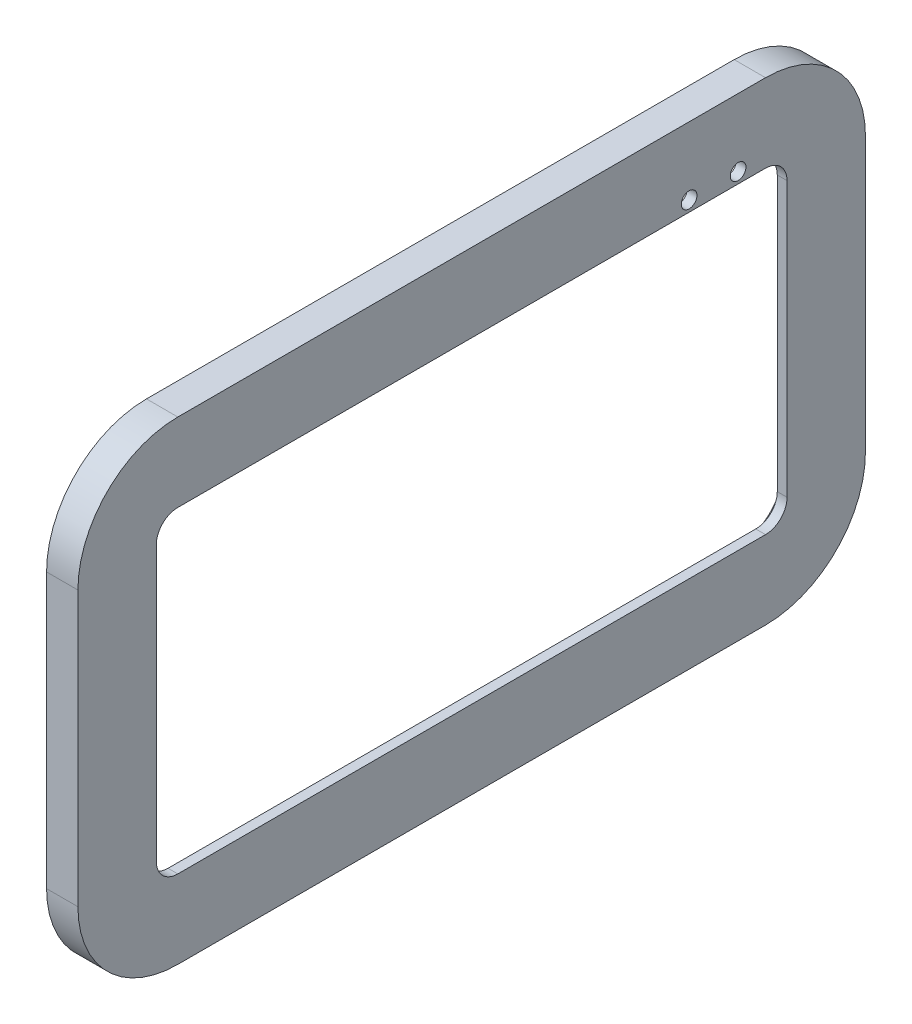
ISO-10303-21;
HEADER;
FILE_DESCRIPTION(('STEP AP214'),'2;1');
FILE_NAME('part.step','',(''),(''),'','','');
FILE_SCHEMA(('AUTOMOTIVE_DESIGN { 1 0 10303 214 1 1 1 1 }'));
ENDSEC;
DATA;
#1=APPLICATION_CONTEXT('core data for automotive mechanical design processes');
#2=APPLICATION_PROTOCOL_DEFINITION('international standard','automotive_design',2000,#1);
#3=PRODUCT_CONTEXT('',#1,'mechanical');
#4=PRODUCT('Part','Part','',(#3));
#5=PRODUCT_RELATED_PRODUCT_CATEGORY('part','',(#4));
#6=PRODUCT_DEFINITION_FORMATION('','',#4);
#7=PRODUCT_DEFINITION_CONTEXT('part definition',#1,'design');
#8=PRODUCT_DEFINITION('design','',#6,#7);
#9=PRODUCT_DEFINITION_SHAPE('','',#8);
#10=(LENGTH_UNIT() NAMED_UNIT(*) SI_UNIT(.MILLI.,.METRE.));
#11=(NAMED_UNIT(*) PLANE_ANGLE_UNIT() SI_UNIT($,.RADIAN.));
#12=(NAMED_UNIT(*) SI_UNIT($,.STERADIAN.) SOLID_ANGLE_UNIT());
#13=UNCERTAINTY_MEASURE_WITH_UNIT(LENGTH_MEASURE(1.E-05),#10,'distance_accuracy_value','');
#14=(GEOMETRIC_REPRESENTATION_CONTEXT(3) GLOBAL_UNCERTAINTY_ASSIGNED_CONTEXT((#13)) GLOBAL_UNIT_ASSIGNED_CONTEXT((#10,
#11,#12)) REPRESENTATION_CONTEXT('',''));
#15=CARTESIAN_POINT('',(0.,0.,0.));
#16=DIRECTION('',(0.,0.,1.));
#17=DIRECTION('',(1.,0.,0.));
#18=AXIS2_PLACEMENT_3D('',#15,#16,#17);
#19=CARTESIAN_POINT('',(13.,81.,0.));
#20=DIRECTION('',(0.,1.,0.));
#21=DIRECTION('',(0.,0.,1.));
#22=AXIS2_PLACEMENT_3D('',#19,#20,#21);
#23=PLANE('',#22);
#24=DIRECTION('',(0.,0.,1.));
#25=VECTOR('',#24,1.);
#26=CARTESIAN_POINT('',(8.,81.,0.));
#27=LINE('',#26,#25);
#28=CARTESIAN_POINT('',(8.,81.,-150.));
#29=VERTEX_POINT('',#28);
#30=CARTESIAN_POINT('',(8.00000000000001,81.,150.));
#31=VERTEX_POINT('',#30);
#32=EDGE_CURVE('E72',#29,#31,#27,.T.);
#33=ORIENTED_EDGE('',*,*,#32,.F.);
#34=DIRECTION('',(1.,0.,0.));
#35=VECTOR('',#34,1.);
#36=CARTESIAN_POINT('',(13.,81.,-150.));
#37=LINE('',#36,#35);
#38=CARTESIAN_POINT('',(13.,81.,-150.));
#39=VERTEX_POINT('',#38);
#40=EDGE_CURVE('E317',#29,#39,#37,.T.);
#41=ORIENTED_EDGE('',*,*,#40,.T.);
#42=DIRECTION('',(0.,0.,-1.));
#43=VECTOR('',#42,1.);
#44=CARTESIAN_POINT('',(13.,81.,0.));
#45=LINE('',#44,#43);
#46=CARTESIAN_POINT('',(13.,81.0000000000001,150.));
#47=VERTEX_POINT('',#46);
#48=EDGE_CURVE('E319',#47,#39,#45,.T.);
#49=ORIENTED_EDGE('',*,*,#48,.F.);
#50=DIRECTION('',(1.,0.,0.));
#51=VECTOR('',#50,1.);
#52=CARTESIAN_POINT('',(13.,81.,150.));
#53=LINE('',#52,#51);
#54=EDGE_CURVE('E366',#31,#47,#53,.T.);
#55=ORIENTED_EDGE('',*,*,#54,.F.);
#56=EDGE_LOOP('',(#33,#41,#49,#55));
#57=FACE_BOUND('',#56,.T.);
#58=ADVANCED_FACE('F48',(#57),#23,.F.);
#59=CARTESIAN_POINT('',(0.,70.,-150.));
#60=DIRECTION('',(-1.,0.,0.));
#61=DIRECTION('',(0.,0.,1.));
#62=AXIS2_PLACEMENT_3D('',#59,#60,#61);
#63=CYLINDRICAL_SURFACE('',#62,11.);
#64=CARTESIAN_POINT('',(8.00000000000001,70.,-150.));
#65=DIRECTION('',(-1.,0.,0.));
#66=DIRECTION('',(0.,-1.,0.));
#67=AXIS2_PLACEMENT_3D('',#64,#65,#66);
#68=CIRCLE('',#67,11.);
#69=CARTESIAN_POINT('',(8.00000000000001,70.,-161.));
#70=VERTEX_POINT('',#69);
#71=EDGE_CURVE('E314',#70,#29,#68,.F.);
#72=ORIENTED_EDGE('',*,*,#71,.F.);
#73=DIRECTION('',(1.,0.,0.));
#74=VECTOR('',#73,1.);
#75=CARTESIAN_POINT('',(13.,70.,-161.));
#76=LINE('',#75,#74);
#77=CARTESIAN_POINT('',(13.,70.,-161.));
#78=VERTEX_POINT('',#77);
#79=EDGE_CURVE('E323',#70,#78,#76,.T.);
#80=ORIENTED_EDGE('',*,*,#79,.T.);
#81=CARTESIAN_POINT('',(13.,70.,-150.));
#82=DIRECTION('',(-1.,0.,0.));
#83=DIRECTION('',(0.,1.,0.));
#84=AXIS2_PLACEMENT_3D('',#81,#82,#83);
#85=CIRCLE('',#84,11.);
#86=EDGE_CURVE('E325',#39,#78,#85,.T.);
#87=ORIENTED_EDGE('',*,*,#86,.F.);
#88=ORIENTED_EDGE('',*,*,#40,.F.);
#89=EDGE_LOOP('',(#72,#80,#87,#88));
#90=FACE_BOUND('',#89,.T.);
#91=ADVANCED_FACE('F469',(#90),#63,.F.);
#92=CARTESIAN_POINT('',(13.,70.,-161.));
#93=DIRECTION('',(0.,0.,-1.));
#94=DIRECTION('',(0.,1.,0.));
#95=AXIS2_PLACEMENT_3D('',#92,#93,#94);
#96=PLANE('',#95);
#97=DIRECTION('',(0.,1.,0.));
#98=VECTOR('',#97,1.);
#99=CARTESIAN_POINT('',(8.00000000000001,70.,-161.));
#100=LINE('',#99,#98);
#101=CARTESIAN_POINT('',(8.00000000000003,-70.,-161.));
#102=VERTEX_POINT('',#101);
#103=EDGE_CURVE('E312',#102,#70,#100,.T.);
#104=ORIENTED_EDGE('',*,*,#103,.F.);
#105=DIRECTION('',(1.,0.,0.));
#106=VECTOR('',#105,1.);
#107=CARTESIAN_POINT('',(13.,-70.,-161.));
#108=LINE('',#107,#106);
#109=CARTESIAN_POINT('',(13.,-70.,-161.));
#110=VERTEX_POINT('',#109);
#111=EDGE_CURVE('E330',#102,#110,#108,.T.);
#112=ORIENTED_EDGE('',*,*,#111,.T.);
#113=DIRECTION('',(0.,-1.,0.));
#114=VECTOR('',#113,1.);
#115=CARTESIAN_POINT('',(13.,70.,-161.));
#116=LINE('',#115,#114);
#117=EDGE_CURVE('E332',#78,#110,#116,.T.);
#118=ORIENTED_EDGE('',*,*,#117,.F.);
#119=ORIENTED_EDGE('',*,*,#79,.F.);
#120=EDGE_LOOP('',(#104,#112,#118,#119));
#121=FACE_BOUND('',#120,.T.);
#122=ADVANCED_FACE('F475',(#121),#96,.F.);
#123=CARTESIAN_POINT('',(0.,-70.,-150.));
#124=DIRECTION('',(-1.,0.,0.));
#125=DIRECTION('',(0.,0.,1.));
#126=AXIS2_PLACEMENT_3D('',#123,#124,#125);
#127=CYLINDRICAL_SURFACE('',#126,11.);
#128=CARTESIAN_POINT('',(8.00000000000003,-70.,-150.));
#129=DIRECTION('',(-1.,0.,0.));
#130=DIRECTION('',(0.,-1.,0.));
#131=AXIS2_PLACEMENT_3D('',#128,#129,#130);
#132=CIRCLE('',#131,11.);
#133=CARTESIAN_POINT('',(8.00000000000003,-81.,-150.));
#134=VERTEX_POINT('',#133);
#135=EDGE_CURVE('E310',#134,#102,#132,.F.);
#136=ORIENTED_EDGE('',*,*,#135,.F.);
#137=DIRECTION('',(1.,0.,0.));
#138=VECTOR('',#137,1.);
#139=CARTESIAN_POINT('',(13.,-81.,-150.));
#140=LINE('',#139,#138);
#141=CARTESIAN_POINT('',(13.,-81.,-150.));
#142=VERTEX_POINT('',#141);
#143=EDGE_CURVE('E337',#134,#142,#140,.T.);
#144=ORIENTED_EDGE('',*,*,#143,.T.);
#145=CARTESIAN_POINT('',(13.,-70.,-150.));
#146=DIRECTION('',(-1.,0.,0.));
#147=DIRECTION('',(0.,0.,-1.));
#148=AXIS2_PLACEMENT_3D('',#145,#146,#147);
#149=CIRCLE('',#148,11.);
#150=EDGE_CURVE('E339',#110,#142,#149,.T.);
#151=ORIENTED_EDGE('',*,*,#150,.F.);
#152=ORIENTED_EDGE('',*,*,#111,.F.);
#153=EDGE_LOOP('',(#136,#144,#151,#152));
#154=FACE_BOUND('',#153,.T.);
#155=ADVANCED_FACE('F483',(#154),#127,.F.);
#156=CARTESIAN_POINT('',(13.,-81.,-150.));
#157=DIRECTION('',(0.,-1.,0.));
#158=DIRECTION('',(0.,0.,-1.));
#159=AXIS2_PLACEMENT_3D('',#156,#157,#158);
#160=PLANE('',#159);
#161=DIRECTION('',(0.,0.,-1.));
#162=VECTOR('',#161,1.);
#163=CARTESIAN_POINT('',(8.00000000000003,-81.,-150.));
#164=LINE('',#163,#162);
#165=CARTESIAN_POINT('',(8.00000000000003,-81.,150.));
#166=VERTEX_POINT('',#165);
#167=EDGE_CURVE('E308',#166,#134,#164,.T.);
#168=ORIENTED_EDGE('',*,*,#167,.F.);
#169=DIRECTION('',(1.,0.,0.));
#170=VECTOR('',#169,1.);
#171=CARTESIAN_POINT('',(13.,-81.,150.));
#172=LINE('',#171,#170);
#173=CARTESIAN_POINT('',(13.,-81.,150.));
#174=VERTEX_POINT('',#173);
#175=EDGE_CURVE('E344',#166,#174,#172,.T.);
#176=ORIENTED_EDGE('',*,*,#175,.T.);
#177=DIRECTION('',(0.,0.,1.));
#178=VECTOR('',#177,1.);
#179=CARTESIAN_POINT('',(13.,-81.,-150.));
#180=LINE('',#179,#178);
#181=EDGE_CURVE('E348',#142,#174,#180,.T.);
#182=ORIENTED_EDGE('',*,*,#181,.F.);
#183=ORIENTED_EDGE('',*,*,#143,.F.);
#184=EDGE_LOOP('',(#168,#176,#182,#183));
#185=FACE_BOUND('',#184,.T.);
#186=ADVANCED_FACE('F487',(#185),#160,.F.);
#187=CARTESIAN_POINT('',(0.,-70.,150.));
#188=DIRECTION('',(-1.,0.,0.));
#189=DIRECTION('',(0.,0.,1.));
#190=AXIS2_PLACEMENT_3D('',#187,#188,#189);
#191=CYLINDRICAL_SURFACE('',#190,11.);
#192=CARTESIAN_POINT('',(8.00000000000003,-70.,150.));
#193=DIRECTION('',(-1.,0.,0.));
#194=DIRECTION('',(0.,-1.,0.));
#195=AXIS2_PLACEMENT_3D('',#192,#193,#194);
#196=CIRCLE('',#195,11.);
#197=CARTESIAN_POINT('',(8.00000000000003,-70.,161.));
#198=VERTEX_POINT('',#197);
#199=EDGE_CURVE('E306',#198,#166,#196,.F.);
#200=ORIENTED_EDGE('',*,*,#199,.F.);
#201=DIRECTION('',(1.,0.,0.));
#202=VECTOR('',#201,1.);
#203=CARTESIAN_POINT('',(13.,-70.,161.));
#204=LINE('',#203,#202);
#205=CARTESIAN_POINT('',(13.,-70.,161.));
#206=VERTEX_POINT('',#205);
#207=EDGE_CURVE('E353',#198,#206,#204,.T.);
#208=ORIENTED_EDGE('',*,*,#207,.T.);
#209=CARTESIAN_POINT('',(13.,-70.,150.));
#210=DIRECTION('',(-1.,0.,0.));
#211=DIRECTION('',(0.,-1.,0.));
#212=AXIS2_PLACEMENT_3D('',#209,#210,#211);
#213=CIRCLE('',#212,11.);
#214=EDGE_CURVE('E355',#174,#206,#213,.T.);
#215=ORIENTED_EDGE('',*,*,#214,.F.);
#216=ORIENTED_EDGE('',*,*,#175,.F.);
#217=EDGE_LOOP('',(#200,#208,#215,#216));
#218=FACE_BOUND('',#217,.T.);
#219=ADVANCED_FACE('F491',(#218),#191,.F.);
#220=CARTESIAN_POINT('',(13.,-70.,161.));
#221=DIRECTION('',(0.,0.,1.));
#222=DIRECTION('',(1.,0.,0.));
#223=AXIS2_PLACEMENT_3D('',#220,#221,#222);
#224=PLANE('',#223);
#225=DIRECTION('',(0.,-1.,0.));
#226=VECTOR('',#225,1.);
#227=CARTESIAN_POINT('',(8.00000000000003,-70.,161.));
#228=LINE('',#227,#226);
#229=CARTESIAN_POINT('',(8.00000000000001,70.,161.));
#230=VERTEX_POINT('',#229);
#231=EDGE_CURVE('E291',#230,#198,#228,.T.);
#232=ORIENTED_EDGE('',*,*,#231,.F.);
#233=DIRECTION('',(1.,0.,0.));
#234=VECTOR('',#233,1.);
#235=CARTESIAN_POINT('',(13.,70.,161.));
#236=LINE('',#235,#234);
#237=CARTESIAN_POINT('',(13.,70.,161.));
#238=VERTEX_POINT('',#237);
#239=EDGE_CURVE('E359',#230,#238,#236,.T.);
#240=ORIENTED_EDGE('',*,*,#239,.T.);
#241=DIRECTION('',(0.,1.,0.));
#242=VECTOR('',#241,1.);
#243=CARTESIAN_POINT('',(13.,-70.,161.));
#244=LINE('',#243,#242);
#245=EDGE_CURVE('E361',#206,#238,#244,.T.);
#246=ORIENTED_EDGE('',*,*,#245,.F.);
#247=ORIENTED_EDGE('',*,*,#207,.F.);
#248=EDGE_LOOP('',(#232,#240,#246,#247));
#249=FACE_BOUND('',#248,.T.);
#250=ADVANCED_FACE('F495',(#249),#224,.F.);
#251=CARTESIAN_POINT('',(0.,70.,150.));
#252=DIRECTION('',(-1.,0.,0.));
#253=DIRECTION('',(0.,0.,1.));
#254=AXIS2_PLACEMENT_3D('',#251,#252,#253);
#255=CYLINDRICAL_SURFACE('',#254,11.);
#256=CARTESIAN_POINT('',(8.00000000000001,70.,150.));
#257=DIRECTION('',(-1.,0.,0.));
#258=DIRECTION('',(0.,-1.,0.));
#259=AXIS2_PLACEMENT_3D('',#256,#257,#258);
#260=CIRCLE('',#259,11.);
#261=EDGE_CURVE('E13',#31,#230,#260,.F.);
#262=ORIENTED_EDGE('',*,*,#261,.F.);
#263=ORIENTED_EDGE('',*,*,#54,.T.);
#264=CARTESIAN_POINT('',(13.,70.,150.));
#265=DIRECTION('',(-1.,0.,0.));
#266=DIRECTION('',(0.,0.,1.));
#267=AXIS2_PLACEMENT_3D('',#264,#265,#266);
#268=CIRCLE('',#267,11.);
#269=EDGE_CURVE('E368',#238,#47,#268,.T.);
#270=ORIENTED_EDGE('',*,*,#269,.F.);
#271=ORIENTED_EDGE('',*,*,#239,.F.);
#272=EDGE_LOOP('',(#262,#263,#270,#271));
#273=FACE_BOUND('',#272,.T.);
#274=ADVANCED_FACE('F499',(#273),#255,.F.);
#275=CARTESIAN_POINT('',(13.,121.,0.));
#276=DIRECTION('',(-1.,0.,0.));
#277=DIRECTION('',(0.,-1.,0.));
#278=AXIS2_PLACEMENT_3D('',#275,#276,#277);
#279=PLANE('',#278);
#280=CARTESIAN_POINT('',(13.,86.5,-111.));
#281=DIRECTION('',(1.,0.,0.));
#282=DIRECTION('',(0.,1.,0.));
#283=AXIS2_PLACEMENT_3D('',#280,#281,#282);
#284=CIRCLE('',#283,4.00000000000002);
#285=CARTESIAN_POINT('',(13.,90.5,-111.));
#286=VERTEX_POINT('',#285);
#287=EDGE_CURVE('E236',#286,#286,#284,.T.);
#288=ORIENTED_EDGE('',*,*,#287,.F.);
#289=EDGE_LOOP('',(#288));
#290=FACE_BOUND('',#289,.T.);
#291=CARTESIAN_POINT('',(13.,86.5,-136.));
#292=DIRECTION('',(1.,0.,0.));
#293=DIRECTION('',(0.,1.,0.));
#294=AXIS2_PLACEMENT_3D('',#291,#292,#293);
#295=CIRCLE('',#294,3.99999999999999);
#296=CARTESIAN_POINT('',(13.,90.5,-136.));
#297=VERTEX_POINT('',#296);
#298=EDGE_CURVE('E235',#297,#297,#295,.T.);
#299=ORIENTED_EDGE('',*,*,#298,.F.);
#300=EDGE_LOOP('',(#299));
#301=FACE_BOUND('',#300,.T.);
#302=CARTESIAN_POINT('',(13.,70.,-150.));
#303=DIRECTION('',(-1.,0.,0.));
#304=DIRECTION('',(0.,1.,0.));
#305=AXIS2_PLACEMENT_3D('',#302,#303,#304);
#306=CIRCLE('',#305,51.);
#307=CARTESIAN_POINT('',(13.,121.,-150.));
#308=VERTEX_POINT('',#307);
#309=CARTESIAN_POINT('',(13.,70.,-201.));
#310=VERTEX_POINT('',#309);
#311=EDGE_CURVE('E329',#308,#310,#306,.T.);
#312=ORIENTED_EDGE('',*,*,#311,.F.);
#313=DIRECTION('',(0.,0.,-1.));
#314=VECTOR('',#313,1.);
#315=CARTESIAN_POINT('',(13.,121.,0.));
#316=LINE('',#315,#314);
#317=CARTESIAN_POINT('',(13.,121.,150.));
#318=VERTEX_POINT('',#317);
#319=EDGE_CURVE('E322',#318,#308,#316,.T.);
#320=ORIENTED_EDGE('',*,*,#319,.F.);
#321=CARTESIAN_POINT('',(13.,70.,150.));
#322=DIRECTION('',(-1.,0.,0.));
#323=DIRECTION('',(0.,0.,1.));
#324=AXIS2_PLACEMENT_3D('',#321,#322,#323);
#325=CIRCLE('',#324,51.);
#326=CARTESIAN_POINT('',(13.,70.,201.));
#327=VERTEX_POINT('',#326);
#328=EDGE_CURVE('E372',#327,#318,#325,.T.);
#329=ORIENTED_EDGE('',*,*,#328,.F.);
#330=DIRECTION('',(0.,1.,0.));
#331=VECTOR('',#330,1.);
#332=CARTESIAN_POINT('',(13.,-70.,201.));
#333=LINE('',#332,#331);
#334=CARTESIAN_POINT('',(13.,-70.,201.));
#335=VERTEX_POINT('',#334);
#336=EDGE_CURVE('E365',#335,#327,#333,.T.);
#337=ORIENTED_EDGE('',*,*,#336,.F.);
#338=CARTESIAN_POINT('',(13.,-70.,150.));
#339=DIRECTION('',(-1.,0.,0.));
#340=DIRECTION('',(0.,-1.,0.));
#341=AXIS2_PLACEMENT_3D('',#338,#339,#340);
#342=CIRCLE('',#341,51.);
#343=CARTESIAN_POINT('',(13.,-121.,150.));
#344=VERTEX_POINT('',#343);
#345=EDGE_CURVE('E358',#344,#335,#342,.T.);
#346=ORIENTED_EDGE('',*,*,#345,.F.);
#347=DIRECTION('',(0.,0.,1.));
#348=VECTOR('',#347,1.);
#349=CARTESIAN_POINT('',(13.,-121.,-150.));
#350=LINE('',#349,#348);
#351=CARTESIAN_POINT('',(13.,-121.,-150.));
#352=VERTEX_POINT('',#351);
#353=EDGE_CURVE('E351',#352,#344,#350,.T.);
#354=ORIENTED_EDGE('',*,*,#353,.F.);
#355=CARTESIAN_POINT('',(13.,-70.,-150.));
#356=DIRECTION('',(-1.,0.,0.));
#357=DIRECTION('',(0.,0.,-1.));
#358=AXIS2_PLACEMENT_3D('',#355,#356,#357);
#359=CIRCLE('',#358,51.);
#360=CARTESIAN_POINT('',(13.,-70.,-201.));
#361=VERTEX_POINT('',#360);
#362=EDGE_CURVE('E343',#361,#352,#359,.T.);
#363=ORIENTED_EDGE('',*,*,#362,.F.);
#364=DIRECTION('',(0.,-1.,0.));
#365=VECTOR('',#364,1.);
#366=CARTESIAN_POINT('',(13.,70.,-201.));
#367=LINE('',#366,#365);
#368=EDGE_CURVE('E336',#310,#361,#367,.T.);
#369=ORIENTED_EDGE('',*,*,#368,.F.);
#370=EDGE_LOOP('',(#312,#320,#329,#337,#346,#354,#363,#369));
#371=FACE_BOUND('',#370,.T.);
#372=ORIENTED_EDGE('',*,*,#48,.T.);
#373=ORIENTED_EDGE('',*,*,#86,.T.);
#374=ORIENTED_EDGE('',*,*,#117,.T.);
#375=ORIENTED_EDGE('',*,*,#150,.T.);
#376=ORIENTED_EDGE('',*,*,#181,.T.);
#377=ORIENTED_EDGE('',*,*,#214,.T.);
#378=ORIENTED_EDGE('',*,*,#245,.T.);
#379=ORIENTED_EDGE('',*,*,#269,.T.);
#380=EDGE_LOOP('',(#372,#373,#374,#375,#376,#377,#378,#379));
#381=FACE_BOUND('',#380,.T.);
#382=ADVANCED_FACE('F503',(#290,#301,#371,#381),#279,.F.);
#383=CARTESIAN_POINT('',(-3.,121.,0.));
#384=DIRECTION('',(0.,-1.,0.));
#385=DIRECTION('',(0.,0.,-1.));
#386=AXIS2_PLACEMENT_3D('',#383,#384,#385);
#387=PLANE('',#386);
#388=DIRECTION('',(0.,0.,-1.));
#389=VECTOR('',#388,1.);
#390=CARTESIAN_POINT('',(-3.,121.,0.));
#391=LINE('',#390,#389);
#392=CARTESIAN_POINT('',(-3.,121.,150.));
#393=VERTEX_POINT('',#392);
#394=CARTESIAN_POINT('',(-3.,121.,-150.));
#395=VERTEX_POINT('',#394);
#396=EDGE_CURVE('E326',#393,#395,#391,.T.);
#397=ORIENTED_EDGE('',*,*,#396,.F.);
#398=DIRECTION('',(-1.,0.,0.));
#399=VECTOR('',#398,1.);
#400=CARTESIAN_POINT('',(-3.,121.,150.));
#401=LINE('',#400,#399);
#402=EDGE_CURVE('E388',#318,#393,#401,.T.);
#403=ORIENTED_EDGE('',*,*,#402,.F.);
#404=ORIENTED_EDGE('',*,*,#319,.T.);
#405=DIRECTION('',(-1.,0.,0.));
#406=VECTOR('',#405,1.);
#407=CARTESIAN_POINT('',(-3.,121.,-150.));
#408=LINE('',#407,#406);
#409=EDGE_CURVE('E374',#308,#395,#408,.T.);
#410=ORIENTED_EDGE('',*,*,#409,.T.);
#411=EDGE_LOOP('',(#397,#403,#404,#410));
#412=FACE_BOUND('',#411,.T.);
#413=ADVANCED_FACE('F507',(#412),#387,.F.);
#414=CARTESIAN_POINT('',(-3.,96.,0.));
#415=DIRECTION('',(1.,0.,0.));
#416=DIRECTION('',(0.,1.,0.));
#417=AXIS2_PLACEMENT_3D('',#414,#415,#416);
#418=PLANE('',#417);
#419=CARTESIAN_POINT('',(-2.99999999999998,0.,-188.5));
#420=DIRECTION('',(-1.,0.,0.));
#421=DIRECTION('',(0.,0.,1.));
#422=AXIS2_PLACEMENT_3D('',#419,#420,#421);
#423=CIRCLE('',#422,4.);
#424=CARTESIAN_POINT('',(-2.99999999999998,0.,-184.5));
#425=VERTEX_POINT('',#424);
#426=EDGE_CURVE('E225',#425,#425,#423,.T.);
#427=ORIENTED_EDGE('',*,*,#426,.F.);
#428=EDGE_LOOP('',(#427));
#429=FACE_BOUND('',#428,.T.);
#430=CARTESIAN_POINT('',(-2.99999999999998,0.,188.5));
#431=DIRECTION('',(-1.,0.,0.));
#432=DIRECTION('',(0.,0.,1.));
#433=AXIS2_PLACEMENT_3D('',#430,#431,#432);
#434=CIRCLE('',#433,4.);
#435=CARTESIAN_POINT('',(-2.99999999999998,0.,192.5));
#436=VERTEX_POINT('',#435);
#437=EDGE_CURVE('E224',#436,#436,#434,.T.);
#438=ORIENTED_EDGE('',*,*,#437,.F.);
#439=EDGE_LOOP('',(#438));
#440=FACE_BOUND('',#439,.T.);
#441=DIRECTION('',(0.,0.,-1.));
#442=VECTOR('',#441,1.);
#443=CARTESIAN_POINT('',(-3.,96.0000000000001,150.));
#444=LINE('',#443,#442);
#445=CARTESIAN_POINT('',(-3.,96.,150.));
#446=VERTEX_POINT('',#445);
#447=CARTESIAN_POINT('',(-3.,96.,-150.));
#448=VERTEX_POINT('',#447);
#449=EDGE_CURVE('E269',#446,#448,#444,.T.);
#450=ORIENTED_EDGE('',*,*,#449,.F.);
#451=CARTESIAN_POINT('',(-2.99999999999999,70.,150.));
#452=DIRECTION('',(-1.,0.,0.));
#453=DIRECTION('',(0.,-1.,0.));
#454=AXIS2_PLACEMENT_3D('',#451,#452,#453);
#455=CIRCLE('',#454,26.);
#456=CARTESIAN_POINT('',(-2.99999999999999,70.,176.));
#457=VERTEX_POINT('',#456);
#458=EDGE_CURVE('E65',#457,#446,#455,.T.);
#459=ORIENTED_EDGE('',*,*,#458,.F.);
#460=DIRECTION('',(0.,1.,0.));
#461=VECTOR('',#460,1.);
#462=CARTESIAN_POINT('',(-2.99999999999997,-70.,176.));
#463=LINE('',#462,#461);
#464=CARTESIAN_POINT('',(-2.99999999999997,-70.,176.));
#465=VERTEX_POINT('',#464);
#466=EDGE_CURVE('E246',#465,#457,#463,.T.);
#467=ORIENTED_EDGE('',*,*,#466,.F.);
#468=CARTESIAN_POINT('',(-2.99999999999997,-70.,150.));
#469=DIRECTION('',(-1.,0.,0.));
#470=DIRECTION('',(0.,-1.,0.));
#471=AXIS2_PLACEMENT_3D('',#468,#469,#470);
#472=CIRCLE('',#471,26.);
#473=CARTESIAN_POINT('',(-2.99999999999997,-96.,150.));
#474=VERTEX_POINT('',#473);
#475=EDGE_CURVE('E284',#474,#465,#472,.T.);
#476=ORIENTED_EDGE('',*,*,#475,.F.);
#477=DIRECTION('',(0.,0.,1.));
#478=VECTOR('',#477,1.);
#479=CARTESIAN_POINT('',(-2.99999999999997,-96.,-150.));
#480=LINE('',#479,#478);
#481=CARTESIAN_POINT('',(-2.99999999999997,-96.,-150.));
#482=VERTEX_POINT('',#481);
#483=EDGE_CURVE('E281',#482,#474,#480,.T.);
#484=ORIENTED_EDGE('',*,*,#483,.F.);
#485=CARTESIAN_POINT('',(-2.99999999999997,-70.,-150.));
#486=DIRECTION('',(-1.,0.,0.));
#487=DIRECTION('',(0.,-1.,0.));
#488=AXIS2_PLACEMENT_3D('',#485,#486,#487);
#489=CIRCLE('',#488,26.);
#490=CARTESIAN_POINT('',(-2.99999999999997,-70.,-176.));
#491=VERTEX_POINT('',#490);
#492=EDGE_CURVE('E278',#491,#482,#489,.T.);
#493=ORIENTED_EDGE('',*,*,#492,.F.);
#494=DIRECTION('',(0.,-1.,0.));
#495=VECTOR('',#494,1.);
#496=CARTESIAN_POINT('',(-2.99999999999999,70.,-176.));
#497=LINE('',#496,#495);
#498=CARTESIAN_POINT('',(-2.99999999999999,70.,-176.));
#499=VERTEX_POINT('',#498);
#500=EDGE_CURVE('E275',#499,#491,#497,.T.);
#501=ORIENTED_EDGE('',*,*,#500,.F.);
#502=CARTESIAN_POINT('',(-2.99999999999999,70.,-150.));
#503=DIRECTION('',(-1.,0.,0.));
#504=DIRECTION('',(0.,-1.,0.));
#505=AXIS2_PLACEMENT_3D('',#502,#503,#504);
#506=CIRCLE('',#505,26.);
#507=EDGE_CURVE('E272',#448,#499,#506,.T.);
#508=ORIENTED_EDGE('',*,*,#507,.F.);
#509=EDGE_LOOP('',(#450,#459,#467,#476,#484,#493,#501,#508));
#510=FACE_BOUND('',#509,.T.);
#511=ORIENTED_EDGE('',*,*,#396,.T.);
#512=CARTESIAN_POINT('',(-3.,70.,-150.));
#513=DIRECTION('',(-1.,0.,0.));
#514=DIRECTION('',(0.,1.,0.));
#515=AXIS2_PLACEMENT_3D('',#512,#513,#514);
#516=CIRCLE('',#515,51.);
#517=CARTESIAN_POINT('',(-3.,70.,-201.));
#518=VERTEX_POINT('',#517);
#519=EDGE_CURVE('E333',#395,#518,#516,.T.);
#520=ORIENTED_EDGE('',*,*,#519,.T.);
#521=DIRECTION('',(0.,-1.,0.));
#522=VECTOR('',#521,1.);
#523=CARTESIAN_POINT('',(-3.,70.,-201.));
#524=LINE('',#523,#522);
#525=CARTESIAN_POINT('',(-3.,-70.,-201.));
#526=VERTEX_POINT('',#525);
#527=EDGE_CURVE('E340',#518,#526,#524,.T.);
#528=ORIENTED_EDGE('',*,*,#527,.T.);
#529=CARTESIAN_POINT('',(-3.,-70.,-150.));
#530=DIRECTION('',(-1.,0.,0.));
#531=DIRECTION('',(0.,0.,-1.));
#532=AXIS2_PLACEMENT_3D('',#529,#530,#531);
#533=CIRCLE('',#532,51.);
#534=CARTESIAN_POINT('',(-3.,-121.,-150.));
#535=VERTEX_POINT('',#534);
#536=EDGE_CURVE('E352',#526,#535,#533,.T.);
#537=ORIENTED_EDGE('',*,*,#536,.T.);
#538=DIRECTION('',(0.,0.,1.));
#539=VECTOR('',#538,1.);
#540=CARTESIAN_POINT('',(-3.,-121.,-150.));
#541=LINE('',#540,#539);
#542=CARTESIAN_POINT('',(-3.,-121.,150.));
#543=VERTEX_POINT('',#542);
#544=EDGE_CURVE('E347',#535,#543,#541,.T.);
#545=ORIENTED_EDGE('',*,*,#544,.T.);
#546=CARTESIAN_POINT('',(-3.,-70.,150.));
#547=DIRECTION('',(-1.,0.,0.));
#548=DIRECTION('',(0.,-1.,0.));
#549=AXIS2_PLACEMENT_3D('',#546,#547,#548);
#550=CIRCLE('',#549,51.);
#551=CARTESIAN_POINT('',(-3.,-70.,201.));
#552=VERTEX_POINT('',#551);
#553=EDGE_CURVE('E362',#543,#552,#550,.T.);
#554=ORIENTED_EDGE('',*,*,#553,.T.);
#555=DIRECTION('',(0.,1.,0.));
#556=VECTOR('',#555,1.);
#557=CARTESIAN_POINT('',(-3.,-70.,201.));
#558=LINE('',#557,#556);
#559=CARTESIAN_POINT('',(-3.,70.,201.));
#560=VERTEX_POINT('',#559);
#561=EDGE_CURVE('E369',#552,#560,#558,.T.);
#562=ORIENTED_EDGE('',*,*,#561,.T.);
#563=CARTESIAN_POINT('',(-3.,70.,150.));
#564=DIRECTION('',(-1.,0.,0.));
#565=DIRECTION('',(0.,0.,1.));
#566=AXIS2_PLACEMENT_3D('',#563,#564,#565);
#567=CIRCLE('',#566,51.);
#568=EDGE_CURVE('E57',#560,#393,#567,.T.);
#569=ORIENTED_EDGE('',*,*,#568,.T.);
#570=EDGE_LOOP('',(#511,#520,#528,#537,#545,#554,#562,#569));
#571=FACE_BOUND('',#570,.T.);
#572=ADVANCED_FACE('F50',(#429,#440,#510,#571),#418,.F.);
#573=CARTESIAN_POINT('',(0.,70.,-150.));
#574=DIRECTION('',(-1.,0.,0.));
#575=DIRECTION('',(0.,0.,1.));
#576=AXIS2_PLACEMENT_3D('',#573,#574,#575);
#577=CYLINDRICAL_SURFACE('',#576,51.);
#578=ORIENTED_EDGE('',*,*,#519,.F.);
#579=ORIENTED_EDGE('',*,*,#409,.F.);
#580=ORIENTED_EDGE('',*,*,#311,.T.);
#581=DIRECTION('',(-1.,0.,0.));
#582=VECTOR('',#581,1.);
#583=CARTESIAN_POINT('',(-3.,70.,-201.));
#584=LINE('',#583,#582);
#585=EDGE_CURVE('E376',#310,#518,#584,.T.);
#586=ORIENTED_EDGE('',*,*,#585,.T.);
#587=EDGE_LOOP('',(#578,#579,#580,#586));
#588=FACE_BOUND('',#587,.T.);
#589=ADVANCED_FACE('F512',(#588),#577,.T.);
#590=CARTESIAN_POINT('',(-3.,70.,-201.));
#591=DIRECTION('',(0.,0.,1.));
#592=DIRECTION('',(0.,-1.,0.));
#593=AXIS2_PLACEMENT_3D('',#590,#591,#592);
#594=PLANE('',#593);
#595=ORIENTED_EDGE('',*,*,#527,.F.);
#596=ORIENTED_EDGE('',*,*,#585,.F.);
#597=ORIENTED_EDGE('',*,*,#368,.T.);
#598=DIRECTION('',(-1.,0.,0.));
#599=VECTOR('',#598,1.);
#600=CARTESIAN_POINT('',(-3.,-70.,-201.));
#601=LINE('',#600,#599);
#602=EDGE_CURVE('E378',#361,#526,#601,.T.);
#603=ORIENTED_EDGE('',*,*,#602,.T.);
#604=EDGE_LOOP('',(#595,#596,#597,#603));
#605=FACE_BOUND('',#604,.T.);
#606=ADVANCED_FACE('F515',(#605),#594,.F.);
#607=CARTESIAN_POINT('',(0.,-70.,-150.));
#608=DIRECTION('',(-1.,0.,0.));
#609=DIRECTION('',(0.,0.,1.));
#610=AXIS2_PLACEMENT_3D('',#607,#608,#609);
#611=CYLINDRICAL_SURFACE('',#610,51.);
#612=ORIENTED_EDGE('',*,*,#536,.F.);
#613=ORIENTED_EDGE('',*,*,#602,.F.);
#614=ORIENTED_EDGE('',*,*,#362,.T.);
#615=DIRECTION('',(-1.,0.,0.));
#616=VECTOR('',#615,1.);
#617=CARTESIAN_POINT('',(-3.,-121.,-150.));
#618=LINE('',#617,#616);
#619=EDGE_CURVE('E380',#352,#535,#618,.T.);
#620=ORIENTED_EDGE('',*,*,#619,.T.);
#621=EDGE_LOOP('',(#612,#613,#614,#620));
#622=FACE_BOUND('',#621,.T.);
#623=ADVANCED_FACE('F519',(#622),#611,.T.);
#624=CARTESIAN_POINT('',(-3.,-121.,-150.));
#625=DIRECTION('',(0.,1.,0.));
#626=DIRECTION('',(0.,0.,1.));
#627=AXIS2_PLACEMENT_3D('',#624,#625,#626);
#628=PLANE('',#627);
#629=ORIENTED_EDGE('',*,*,#544,.F.);
#630=ORIENTED_EDGE('',*,*,#619,.F.);
#631=ORIENTED_EDGE('',*,*,#353,.T.);
#632=DIRECTION('',(-1.,0.,0.));
#633=VECTOR('',#632,1.);
#634=CARTESIAN_POINT('',(-3.,-121.,150.));
#635=LINE('',#634,#633);
#636=EDGE_CURVE('E346',#344,#543,#635,.T.);
#637=ORIENTED_EDGE('',*,*,#636,.T.);
#638=EDGE_LOOP('',(#629,#630,#631,#637));
#639=FACE_BOUND('',#638,.T.);
#640=ADVANCED_FACE('F523',(#639),#628,.F.);
#641=CARTESIAN_POINT('',(0.,-70.,150.));
#642=DIRECTION('',(-1.,0.,0.));
#643=DIRECTION('',(0.,0.,1.));
#644=AXIS2_PLACEMENT_3D('',#641,#642,#643);
#645=CYLINDRICAL_SURFACE('',#644,51.);
#646=ORIENTED_EDGE('',*,*,#553,.F.);
#647=ORIENTED_EDGE('',*,*,#636,.F.);
#648=ORIENTED_EDGE('',*,*,#345,.T.);
#649=DIRECTION('',(-1.,0.,0.));
#650=VECTOR('',#649,1.);
#651=CARTESIAN_POINT('',(-3.,-70.,201.));
#652=LINE('',#651,#650);
#653=EDGE_CURVE('E383',#335,#552,#652,.T.);
#654=ORIENTED_EDGE('',*,*,#653,.T.);
#655=EDGE_LOOP('',(#646,#647,#648,#654));
#656=FACE_BOUND('',#655,.T.);
#657=ADVANCED_FACE('F527',(#656),#645,.T.);
#658=CARTESIAN_POINT('',(-3.,-70.,201.));
#659=DIRECTION('',(0.,0.,-1.));
#660=DIRECTION('',(-1.,0.,0.));
#661=AXIS2_PLACEMENT_3D('',#658,#659,#660);
#662=PLANE('',#661);
#663=ORIENTED_EDGE('',*,*,#561,.F.);
#664=ORIENTED_EDGE('',*,*,#653,.F.);
#665=ORIENTED_EDGE('',*,*,#336,.T.);
#666=DIRECTION('',(-1.,0.,0.));
#667=VECTOR('',#666,1.);
#668=CARTESIAN_POINT('',(-3.,70.,201.));
#669=LINE('',#668,#667);
#670=EDGE_CURVE('E385',#327,#560,#669,.T.);
#671=ORIENTED_EDGE('',*,*,#670,.T.);
#672=EDGE_LOOP('',(#663,#664,#665,#671));
#673=FACE_BOUND('',#672,.T.);
#674=ADVANCED_FACE('F531',(#673),#662,.F.);
#675=CARTESIAN_POINT('',(0.,70.,150.));
#676=DIRECTION('',(-1.,0.,0.));
#677=DIRECTION('',(0.,0.,1.));
#678=AXIS2_PLACEMENT_3D('',#675,#676,#677);
#679=CYLINDRICAL_SURFACE('',#678,51.);
#680=ORIENTED_EDGE('',*,*,#568,.F.);
#681=ORIENTED_EDGE('',*,*,#670,.F.);
#682=ORIENTED_EDGE('',*,*,#328,.T.);
#683=ORIENTED_EDGE('',*,*,#402,.T.);
#684=EDGE_LOOP('',(#680,#681,#682,#683));
#685=FACE_BOUND('',#684,.T.);
#686=ADVANCED_FACE('F426',(#685),#679,.T.);
#687=CARTESIAN_POINT('',(8.00000000000001,70.,150.));
#688=DIRECTION('',(-1.,0.,0.));
#689=DIRECTION('',(0.,-1.,0.));
#690=AXIS2_PLACEMENT_3D('',#687,#688,#689);
#691=PLANE('',#690);
#692=CARTESIAN_POINT('',(8.,86.5,-111.));
#693=DIRECTION('',(-1.,0.,0.));
#694=DIRECTION('',(0.,-1.,0.));
#695=AXIS2_PLACEMENT_3D('',#692,#693,#694);
#696=CIRCLE('',#695,4.00000000000002);
#697=CARTESIAN_POINT('',(8.,82.5,-111.));
#698=VERTEX_POINT('',#697);
#699=EDGE_CURVE('E52',#698,#698,#696,.T.);
#700=ORIENTED_EDGE('',*,*,#699,.F.);
#701=EDGE_LOOP('',(#700));
#702=FACE_BOUND('',#701,.T.);
#703=CARTESIAN_POINT('',(8.,86.5,-136.));
#704=DIRECTION('',(-1.,0.,0.));
#705=DIRECTION('',(0.,-1.,0.));
#706=AXIS2_PLACEMENT_3D('',#703,#704,#705);
#707=CIRCLE('',#706,3.99999999999999);
#708=CARTESIAN_POINT('',(8.,82.5,-136.));
#709=VERTEX_POINT('',#708);
#710=EDGE_CURVE('E239',#709,#709,#707,.T.);
#711=ORIENTED_EDGE('',*,*,#710,.F.);
#712=EDGE_LOOP('',(#711));
#713=FACE_BOUND('',#712,.T.);
#714=CARTESIAN_POINT('',(8.00000000000001,70.,150.));
#715=DIRECTION('',(-1.,0.,0.));
#716=DIRECTION('',(0.,-1.,0.));
#717=AXIS2_PLACEMENT_3D('',#714,#715,#716);
#718=CIRCLE('',#717,26.);
#719=CARTESIAN_POINT('',(8.00000000000001,70.,176.));
#720=VERTEX_POINT('',#719);
#721=CARTESIAN_POINT('',(8.,96.0000000000001,150.));
#722=VERTEX_POINT('',#721);
#723=EDGE_CURVE('E242',#720,#722,#718,.T.);
#724=ORIENTED_EDGE('',*,*,#723,.T.);
#725=DIRECTION('',(0.,0.,-1.));
#726=VECTOR('',#725,1.);
#727=CARTESIAN_POINT('',(8.,96.0000000000001,150.));
#728=LINE('',#727,#726);
#729=CARTESIAN_POINT('',(8.,96.,-150.));
#730=VERTEX_POINT('',#729);
#731=EDGE_CURVE('E245',#722,#730,#728,.T.);
#732=ORIENTED_EDGE('',*,*,#731,.T.);
#733=CARTESIAN_POINT('',(8.00000000000001,70.,-150.));
#734=DIRECTION('',(-1.,0.,0.));
#735=DIRECTION('',(0.,-1.,0.));
#736=AXIS2_PLACEMENT_3D('',#733,#734,#735);
#737=CIRCLE('',#736,26.);
#738=CARTESIAN_POINT('',(8.00000000000001,70.,-176.));
#739=VERTEX_POINT('',#738);
#740=EDGE_CURVE('E249',#730,#739,#737,.T.);
#741=ORIENTED_EDGE('',*,*,#740,.T.);
#742=DIRECTION('',(0.,-1.,0.));
#743=VECTOR('',#742,1.);
#744=CARTESIAN_POINT('',(8.00000000000001,70.,-176.));
#745=LINE('',#744,#743);
#746=CARTESIAN_POINT('',(8.00000000000003,-70.,-176.));
#747=VERTEX_POINT('',#746);
#748=EDGE_CURVE('E252',#739,#747,#745,.T.);
#749=ORIENTED_EDGE('',*,*,#748,.T.);
#750=CARTESIAN_POINT('',(8.00000000000003,-70.,-150.));
#751=DIRECTION('',(-1.,0.,0.));
#752=DIRECTION('',(0.,-1.,0.));
#753=AXIS2_PLACEMENT_3D('',#750,#751,#752);
#754=CIRCLE('',#753,26.);
#755=CARTESIAN_POINT('',(8.00000000000004,-96.,-150.));
#756=VERTEX_POINT('',#755);
#757=EDGE_CURVE('E255',#747,#756,#754,.T.);
#758=ORIENTED_EDGE('',*,*,#757,.T.);
#759=DIRECTION('',(0.,0.,1.));
#760=VECTOR('',#759,1.);
#761=CARTESIAN_POINT('',(8.00000000000004,-96.,-150.));
#762=LINE('',#761,#760);
#763=CARTESIAN_POINT('',(8.00000000000004,-96.,150.));
#764=VERTEX_POINT('',#763);
#765=EDGE_CURVE('E258',#756,#764,#762,.T.);
#766=ORIENTED_EDGE('',*,*,#765,.T.);
#767=CARTESIAN_POINT('',(8.00000000000003,-70.,150.));
#768=DIRECTION('',(-1.,0.,0.));
#769=DIRECTION('',(0.,-1.,0.));
#770=AXIS2_PLACEMENT_3D('',#767,#768,#769);
#771=CIRCLE('',#770,26.);
#772=CARTESIAN_POINT('',(8.00000000000003,-70.,176.));
#773=VERTEX_POINT('',#772);
#774=EDGE_CURVE('E261',#764,#773,#771,.T.);
#775=ORIENTED_EDGE('',*,*,#774,.T.);
#776=DIRECTION('',(0.,1.,0.));
#777=VECTOR('',#776,1.);
#778=CARTESIAN_POINT('',(8.00000000000003,-70.,176.));
#779=LINE('',#778,#777);
#780=EDGE_CURVE('E264',#773,#720,#779,.T.);
#781=ORIENTED_EDGE('',*,*,#780,.T.);
#782=EDGE_LOOP('',(#724,#732,#741,#749,#758,#766,#775,#781));
#783=FACE_BOUND('',#782,.T.);
#784=ORIENTED_EDGE('',*,*,#32,.T.);
#785=ORIENTED_EDGE('',*,*,#261,.T.);
#786=ORIENTED_EDGE('',*,*,#231,.T.);
#787=ORIENTED_EDGE('',*,*,#199,.T.);
#788=ORIENTED_EDGE('',*,*,#167,.T.);
#789=ORIENTED_EDGE('',*,*,#135,.T.);
#790=ORIENTED_EDGE('',*,*,#103,.T.);
#791=ORIENTED_EDGE('',*,*,#71,.T.);
#792=EDGE_LOOP('',(#784,#785,#786,#787,#788,#789,#790,#791));
#793=FACE_BOUND('',#792,.T.);
#794=ADVANCED_FACE('F422',(#702,#713,#783,#793),#691,.T.);
#795=CARTESIAN_POINT('',(8.00000000000001,70.,150.));
#796=DIRECTION('',(-1.,0.,0.));
#797=DIRECTION('',(0.,-1.,0.));
#798=AXIS2_PLACEMENT_3D('',#795,#796,#797);
#799=CYLINDRICAL_SURFACE('',#798,26.);
#800=ORIENTED_EDGE('',*,*,#458,.T.);
#801=DIRECTION('',(-1.,0.,0.));
#802=VECTOR('',#801,1.);
#803=CARTESIAN_POINT('',(8.,96.0000000000001,150.));
#804=LINE('',#803,#802);
#805=EDGE_CURVE('E267',#722,#446,#804,.T.);
#806=ORIENTED_EDGE('',*,*,#805,.F.);
#807=ORIENTED_EDGE('',*,*,#723,.F.);
#808=DIRECTION('',(-1.,0.,0.));
#809=VECTOR('',#808,1.);
#810=CARTESIAN_POINT('',(8.00000000000001,70.,176.));
#811=LINE('',#810,#809);
#812=EDGE_CURVE('E289',#720,#457,#811,.T.);
#813=ORIENTED_EDGE('',*,*,#812,.T.);
#814=EDGE_LOOP('',(#800,#806,#807,#813));
#815=FACE_BOUND('',#814,.T.);
#816=ADVANCED_FACE('F425',(#815),#799,.F.);
#817=CARTESIAN_POINT('',(8.00000000000003,-70.,176.));
#818=DIRECTION('',(0.,0.,1.));
#819=DIRECTION('',(1.,0.,0.));
#820=AXIS2_PLACEMENT_3D('',#817,#818,#819);
#821=PLANE('',#820);
#822=ORIENTED_EDGE('',*,*,#466,.T.);
#823=ORIENTED_EDGE('',*,*,#812,.F.);
#824=ORIENTED_EDGE('',*,*,#780,.F.);
#825=DIRECTION('',(-1.,0.,0.));
#826=VECTOR('',#825,1.);
#827=CARTESIAN_POINT('',(8.00000000000003,-70.,176.));
#828=LINE('',#827,#826);
#829=EDGE_CURVE('E292',#773,#465,#828,.T.);
#830=ORIENTED_EDGE('',*,*,#829,.T.);
#831=EDGE_LOOP('',(#822,#823,#824,#830));
#832=FACE_BOUND('',#831,.T.);
#833=ADVANCED_FACE('F454',(#832),#821,.F.);
#834=CARTESIAN_POINT('',(8.00000000000003,-70.,150.));
#835=DIRECTION('',(-1.,0.,0.));
#836=DIRECTION('',(0.,-1.,0.));
#837=AXIS2_PLACEMENT_3D('',#834,#835,#836);
#838=CYLINDRICAL_SURFACE('',#837,26.);
#839=ORIENTED_EDGE('',*,*,#475,.T.);
#840=ORIENTED_EDGE('',*,*,#829,.F.);
#841=ORIENTED_EDGE('',*,*,#774,.F.);
#842=DIRECTION('',(-1.,0.,0.));
#843=VECTOR('',#842,1.);
#844=CARTESIAN_POINT('',(8.00000000000004,-96.,150.));
#845=LINE('',#844,#843);
#846=EDGE_CURVE('E294',#764,#474,#845,.T.);
#847=ORIENTED_EDGE('',*,*,#846,.T.);
#848=EDGE_LOOP('',(#839,#840,#841,#847));
#849=FACE_BOUND('',#848,.T.);
#850=ADVANCED_FACE('F459',(#849),#838,.F.);
#851=CARTESIAN_POINT('',(8.00000000000004,-96.,-150.));
#852=DIRECTION('',(0.,-1.,0.));
#853=DIRECTION('',(1.,0.,0.));
#854=AXIS2_PLACEMENT_3D('',#851,#852,#853);
#855=PLANE('',#854);
#856=ORIENTED_EDGE('',*,*,#483,.T.);
#857=ORIENTED_EDGE('',*,*,#846,.F.);
#858=ORIENTED_EDGE('',*,*,#765,.F.);
#859=DIRECTION('',(-1.,0.,0.));
#860=VECTOR('',#859,1.);
#861=CARTESIAN_POINT('',(8.00000000000004,-96.,-150.));
#862=LINE('',#861,#860);
#863=EDGE_CURVE('E296',#756,#482,#862,.T.);
#864=ORIENTED_EDGE('',*,*,#863,.T.);
#865=EDGE_LOOP('',(#856,#857,#858,#864));
#866=FACE_BOUND('',#865,.T.);
#867=ADVANCED_FACE('F450',(#866),#855,.F.);
#868=CARTESIAN_POINT('',(8.00000000000003,-70.,-150.));
#869=DIRECTION('',(-1.,0.,0.));
#870=DIRECTION('',(0.,-1.,0.));
#871=AXIS2_PLACEMENT_3D('',#868,#869,#870);
#872=CYLINDRICAL_SURFACE('',#871,26.);
#873=ORIENTED_EDGE('',*,*,#492,.T.);
#874=ORIENTED_EDGE('',*,*,#863,.F.);
#875=ORIENTED_EDGE('',*,*,#757,.F.);
#876=DIRECTION('',(-1.,0.,0.));
#877=VECTOR('',#876,1.);
#878=CARTESIAN_POINT('',(8.00000000000003,-70.,-176.));
#879=LINE('',#878,#877);
#880=EDGE_CURVE('E298',#747,#491,#879,.T.);
#881=ORIENTED_EDGE('',*,*,#880,.T.);
#882=EDGE_LOOP('',(#873,#874,#875,#881));
#883=FACE_BOUND('',#882,.T.);
#884=ADVANCED_FACE('F446',(#883),#872,.F.);
#885=CARTESIAN_POINT('',(8.00000000000001,70.,-176.));
#886=DIRECTION('',(0.,0.,-1.));
#887=DIRECTION('',(0.,1.,0.));
#888=AXIS2_PLACEMENT_3D('',#885,#886,#887);
#889=PLANE('',#888);
#890=ORIENTED_EDGE('',*,*,#500,.T.);
#891=ORIENTED_EDGE('',*,*,#880,.F.);
#892=ORIENTED_EDGE('',*,*,#748,.F.);
#893=DIRECTION('',(-1.,0.,0.));
#894=VECTOR('',#893,1.);
#895=CARTESIAN_POINT('',(8.00000000000001,70.,-176.));
#896=LINE('',#895,#894);
#897=EDGE_CURVE('E300',#739,#499,#896,.T.);
#898=ORIENTED_EDGE('',*,*,#897,.T.);
#899=EDGE_LOOP('',(#890,#891,#892,#898));
#900=FACE_BOUND('',#899,.T.);
#901=ADVANCED_FACE('F442',(#900),#889,.F.);
#902=CARTESIAN_POINT('',(8.00000000000001,70.,-150.));
#903=DIRECTION('',(-1.,0.,0.));
#904=DIRECTION('',(0.,-1.,0.));
#905=AXIS2_PLACEMENT_3D('',#902,#903,#904);
#906=CYLINDRICAL_SURFACE('',#905,26.);
#907=ORIENTED_EDGE('',*,*,#507,.T.);
#908=ORIENTED_EDGE('',*,*,#897,.F.);
#909=ORIENTED_EDGE('',*,*,#740,.F.);
#910=DIRECTION('',(-1.,0.,0.));
#911=VECTOR('',#910,1.);
#912=CARTESIAN_POINT('',(8.,96.,-150.));
#913=LINE('',#912,#911);
#914=EDGE_CURVE('E302',#730,#448,#913,.T.);
#915=ORIENTED_EDGE('',*,*,#914,.T.);
#916=EDGE_LOOP('',(#907,#908,#909,#915));
#917=FACE_BOUND('',#916,.T.);
#918=ADVANCED_FACE('F438',(#917),#906,.F.);
#919=CARTESIAN_POINT('',(8.,96.0000000000001,150.));
#920=DIRECTION('',(0.,1.,0.));
#921=DIRECTION('',(-1.,0.,0.));
#922=AXIS2_PLACEMENT_3D('',#919,#920,#921);
#923=PLANE('',#922);
#924=ORIENTED_EDGE('',*,*,#449,.T.);
#925=ORIENTED_EDGE('',*,*,#914,.F.);
#926=ORIENTED_EDGE('',*,*,#731,.F.);
#927=ORIENTED_EDGE('',*,*,#805,.T.);
#928=EDGE_LOOP('',(#924,#925,#926,#927));
#929=FACE_BOUND('',#928,.T.);
#930=ADVANCED_FACE('F434',(#929),#923,.F.);
#931=CARTESIAN_POINT('',(-3.00000000000004,86.5,-136.));
#932=DIRECTION('',(1.,0.,0.));
#933=DIRECTION('',(0.,1.,0.));
#934=AXIS2_PLACEMENT_3D('',#931,#932,#933);
#935=CYLINDRICAL_SURFACE('',#934,3.99999999999999);
#936=ORIENTED_EDGE('',*,*,#710,.T.);
#937=EDGE_LOOP('',(#936));
#938=FACE_BOUND('',#937,.T.);
#939=ORIENTED_EDGE('',*,*,#298,.T.);
#940=EDGE_LOOP('',(#939));
#941=FACE_BOUND('',#940,.T.);
#942=ADVANCED_FACE('F607',(#938,#941),#935,.F.);
#943=CARTESIAN_POINT('',(-3.00000000000004,86.5,-111.));
#944=DIRECTION('',(1.,0.,0.));
#945=DIRECTION('',(0.,1.,0.));
#946=AXIS2_PLACEMENT_3D('',#943,#944,#945);
#947=CYLINDRICAL_SURFACE('',#946,4.00000000000002);
#948=ORIENTED_EDGE('',*,*,#699,.T.);
#949=EDGE_LOOP('',(#948));
#950=FACE_BOUND('',#949,.T.);
#951=ORIENTED_EDGE('',*,*,#287,.T.);
#952=EDGE_LOOP('',(#951));
#953=FACE_BOUND('',#952,.T.);
#954=ADVANCED_FACE('F419',(#950,#953),#947,.F.);
#955=CARTESIAN_POINT('',(9.00000000000002,0.,188.5));
#956=DIRECTION('',(-1.,0.,0.));
#957=DIRECTION('',(0.,0.,1.));
#958=AXIS2_PLACEMENT_3D('',#955,#956,#957);
#959=CONICAL_SURFACE('',#958,4.,1.02974425867665);
#960=CARTESIAN_POINT('',(11.4034424761103,0.,188.5));
#961=VERTEX_POINT('',#960);
#962=VERTEX_LOOP('',#961);
#963=FACE_BOUND('',#962,.T.);
#964=CARTESIAN_POINT('',(9.00000000000002,0.,188.5));
#965=DIRECTION('',(-1.,0.,0.));
#966=DIRECTION('',(0.,0.,1.));
#967=AXIS2_PLACEMENT_3D('',#964,#965,#966);
#968=CIRCLE('',#967,4.);
#969=CARTESIAN_POINT('',(9.00000000000002,0.,192.5));
#970=VERTEX_POINT('',#969);
#971=EDGE_CURVE('E228',#970,#970,#968,.T.);
#972=ORIENTED_EDGE('',*,*,#971,.T.);
#973=EDGE_LOOP('',(#972));
#974=FACE_BOUND('',#973,.T.);
#975=ADVANCED_FACE('F594',(#963,#974),#959,.F.);
#976=CARTESIAN_POINT('',(-2.99999999999998,0.,188.5));
#977=DIRECTION('',(-1.,0.,0.));
#978=DIRECTION('',(0.,0.,1.));
#979=AXIS2_PLACEMENT_3D('',#976,#977,#978);
#980=CYLINDRICAL_SURFACE('',#979,4.);
#981=ORIENTED_EDGE('',*,*,#971,.F.);
#982=EDGE_LOOP('',(#981));
#983=FACE_BOUND('',#982,.T.);
#984=ORIENTED_EDGE('',*,*,#437,.T.);
#985=EDGE_LOOP('',(#984));
#986=FACE_BOUND('',#985,.T.);
#987=ADVANCED_FACE('F218',(#983,#986),#980,.F.);
#988=CARTESIAN_POINT('',(9.00000000000002,0.,-188.5));
#989=DIRECTION('',(-1.,0.,0.));
#990=DIRECTION('',(0.,0.,1.));
#991=AXIS2_PLACEMENT_3D('',#988,#989,#990);
#992=CONICAL_SURFACE('',#991,4.,1.02974425867665);
#993=CARTESIAN_POINT('',(11.4034424761103,0.,-188.5));
#994=VERTEX_POINT('',#993);
#995=VERTEX_LOOP('',#994);
#996=FACE_BOUND('',#995,.T.);
#997=CARTESIAN_POINT('',(9.00000000000002,0.,-188.5));
#998=DIRECTION('',(-1.,0.,0.));
#999=DIRECTION('',(0.,0.,1.));
#1000=AXIS2_PLACEMENT_3D('',#997,#998,#999);
#1001=CIRCLE('',#1000,4.);
#1002=CARTESIAN_POINT('',(9.00000000000002,0.,-184.5));
#1003=VERTEX_POINT('',#1002);
#1004=EDGE_CURVE('E222',#1003,#1003,#1001,.T.);
#1005=ORIENTED_EDGE('',*,*,#1004,.T.);
#1006=EDGE_LOOP('',(#1005));
#1007=FACE_BOUND('',#1006,.T.);
#1008=ADVANCED_FACE('F214',(#996,#1007),#992,.F.);
#1009=CARTESIAN_POINT('',(-2.99999999999998,0.,-188.5));
#1010=DIRECTION('',(-1.,0.,0.));
#1011=DIRECTION('',(0.,0.,1.));
#1012=AXIS2_PLACEMENT_3D('',#1009,#1010,#1011);
#1013=CYLINDRICAL_SURFACE('',#1012,4.);
#1014=ORIENTED_EDGE('',*,*,#1004,.F.);
#1015=EDGE_LOOP('',(#1014));
#1016=FACE_BOUND('',#1015,.T.);
#1017=ORIENTED_EDGE('',*,*,#426,.T.);
#1018=EDGE_LOOP('',(#1017));
#1019=FACE_BOUND('',#1018,.T.);
#1020=ADVANCED_FACE('F217',(#1016,#1019),#1013,.F.);
#1021=CLOSED_SHELL('',(#58,#91,#122,#155,#186,#219,#250,#274,#382,#413,#572,#589,#606,#623,#640,
#657,#674,#686,#794,#816,#833,#850,#867,#884,#901,#918,#930,#942,#954,#975,#987,#1008,#1020));
#1022=MANIFOLD_SOLID_BREP('B2',#1021);
#1023=ADVANCED_BREP_SHAPE_REPRESENTATION('',(#18,#1022),#14);
#1024=SHAPE_DEFINITION_REPRESENTATION(#9,#1023);
ENDSEC;
END-ISO-10303-21;
